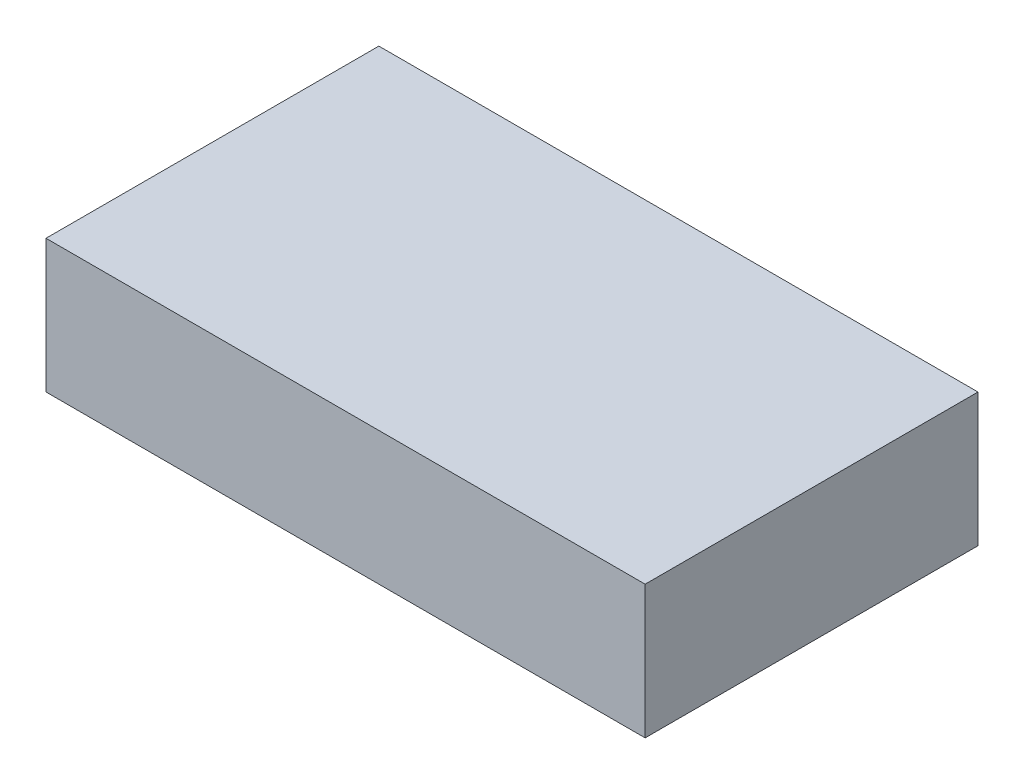
ISO-10303-21;
HEADER;
FILE_DESCRIPTION(('STEP AP214'),'2;1');
FILE_NAME('part.step','',(''),(''),'','','');
FILE_SCHEMA(('AUTOMOTIVE_DESIGN { 1 0 10303 214 1 1 1 1 }'));
ENDSEC;
DATA;
#1=APPLICATION_CONTEXT('core data for automotive mechanical design processes');
#2=APPLICATION_PROTOCOL_DEFINITION('international standard','automotive_design',2000,#1);
#3=PRODUCT_CONTEXT('',#1,'mechanical');
#4=PRODUCT('Part','Part','',(#3));
#5=PRODUCT_RELATED_PRODUCT_CATEGORY('part','',(#4));
#6=PRODUCT_DEFINITION_FORMATION('','',#4);
#7=PRODUCT_DEFINITION_CONTEXT('part definition',#1,'design');
#8=PRODUCT_DEFINITION('design','',#6,#7);
#9=PRODUCT_DEFINITION_SHAPE('','',#8);
#10=(LENGTH_UNIT() NAMED_UNIT(*) SI_UNIT(.MILLI.,.METRE.));
#11=(NAMED_UNIT(*) PLANE_ANGLE_UNIT() SI_UNIT($,.RADIAN.));
#12=(NAMED_UNIT(*) SI_UNIT($,.STERADIAN.) SOLID_ANGLE_UNIT());
#13=UNCERTAINTY_MEASURE_WITH_UNIT(LENGTH_MEASURE(1.E-05),#10,'distance_accuracy_value','');
#14=(GEOMETRIC_REPRESENTATION_CONTEXT(3) GLOBAL_UNCERTAINTY_ASSIGNED_CONTEXT((#13)) GLOBAL_UNIT_ASSIGNED_CONTEXT((#10,
#11,#12)) REPRESENTATION_CONTEXT('',''));
#15=CARTESIAN_POINT('',(0.,0.,0.));
#16=DIRECTION('',(0.,0.,1.));
#17=DIRECTION('',(1.,0.,0.));
#18=AXIS2_PLACEMENT_3D('',#15,#16,#17);
#19=CARTESIAN_POINT('',(13.5,6.,-7.5));
#20=DIRECTION('',(-1.,0.,0.));
#21=DIRECTION('',(0.,0.,1.));
#22=AXIS2_PLACEMENT_3D('',#19,#20,#21);
#23=PLANE('',#22);
#24=DIRECTION('',(0.,0.,-1.));
#25=VECTOR('',#24,1.);
#26=CARTESIAN_POINT('',(13.5,0.,-7.5));
#27=LINE('',#26,#25);
#28=CARTESIAN_POINT('',(13.5,0.,7.5));
#29=VERTEX_POINT('',#28);
#30=CARTESIAN_POINT('',(13.5,0.,-7.5));
#31=VERTEX_POINT('',#30);
#32=EDGE_CURVE('E96',#29,#31,#27,.T.);
#33=ORIENTED_EDGE('',*,*,#32,.T.);
#34=DIRECTION('',(0.,-1.,0.));
#35=VECTOR('',#34,1.);
#36=CARTESIAN_POINT('',(13.5,6.,-7.5));
#37=LINE('',#36,#35);
#38=CARTESIAN_POINT('',(13.5,6.,-7.5));
#39=VERTEX_POINT('',#38);
#40=EDGE_CURVE('E11',#39,#31,#37,.T.);
#41=ORIENTED_EDGE('',*,*,#40,.F.);
#42=DIRECTION('',(0.,0.,-1.));
#43=VECTOR('',#42,1.);
#44=CARTESIAN_POINT('',(13.5,6.,-7.5));
#45=LINE('',#44,#43);
#46=CARTESIAN_POINT('',(13.5,6.,7.5));
#47=VERTEX_POINT('',#46);
#48=EDGE_CURVE('E84',#47,#39,#45,.T.);
#49=ORIENTED_EDGE('',*,*,#48,.F.);
#50=DIRECTION('',(0.,-1.,0.));
#51=VECTOR('',#50,1.);
#52=CARTESIAN_POINT('',(13.5,6.,7.5));
#53=LINE('',#52,#51);
#54=EDGE_CURVE('E92',#47,#29,#53,.T.);
#55=ORIENTED_EDGE('',*,*,#54,.T.);
#56=EDGE_LOOP('',(#33,#41,#49,#55));
#57=FACE_BOUND('',#56,.T.);
#58=ADVANCED_FACE('F33',(#57),#23,.F.);
#59=CARTESIAN_POINT('',(-13.5,6.,-7.5));
#60=DIRECTION('',(0.,0.,1.));
#61=DIRECTION('',(1.,0.,0.));
#62=AXIS2_PLACEMENT_3D('',#59,#60,#61);
#63=PLANE('',#62);
#64=DIRECTION('',(-1.,0.,0.));
#65=VECTOR('',#64,1.);
#66=CARTESIAN_POINT('',(-13.5,0.,-7.5));
#67=LINE('',#66,#65);
#68=CARTESIAN_POINT('',(-13.5,0.,-7.5));
#69=VERTEX_POINT('',#68);
#70=EDGE_CURVE('E88',#31,#69,#67,.T.);
#71=ORIENTED_EDGE('',*,*,#70,.T.);
#72=DIRECTION('',(0.,-1.,0.));
#73=VECTOR('',#72,1.);
#74=CARTESIAN_POINT('',(-13.5,6.,-7.5));
#75=LINE('',#74,#73);
#76=CARTESIAN_POINT('',(-13.5,6.,-7.5));
#77=VERTEX_POINT('',#76);
#78=EDGE_CURVE('E41',#77,#69,#75,.T.);
#79=ORIENTED_EDGE('',*,*,#78,.F.);
#80=DIRECTION('',(-1.,0.,0.));
#81=VECTOR('',#80,1.);
#82=CARTESIAN_POINT('',(-13.5,6.,-7.5));
#83=LINE('',#82,#81);
#84=EDGE_CURVE('E79',#39,#77,#83,.T.);
#85=ORIENTED_EDGE('',*,*,#84,.F.);
#86=ORIENTED_EDGE('',*,*,#40,.T.);
#87=EDGE_LOOP('',(#71,#79,#85,#86));
#88=FACE_BOUND('',#87,.T.);
#89=ADVANCED_FACE('F87',(#88),#63,.F.);
#90=CARTESIAN_POINT('',(-13.5,6.,-7.5));
#91=DIRECTION('',(1.,0.,0.));
#92=DIRECTION('',(0.,0.,-1.));
#93=AXIS2_PLACEMENT_3D('',#90,#91,#92);
#94=PLANE('',#93);
#95=DIRECTION('',(0.,0.,1.));
#96=VECTOR('',#95,1.);
#97=CARTESIAN_POINT('',(-13.5,0.,-7.5));
#98=LINE('',#97,#96);
#99=CARTESIAN_POINT('',(-13.5,0.,7.5));
#100=VERTEX_POINT('',#99);
#101=EDGE_CURVE('E66',#69,#100,#98,.T.);
#102=ORIENTED_EDGE('',*,*,#101,.T.);
#103=DIRECTION('',(0.,-1.,0.));
#104=VECTOR('',#103,1.);
#105=CARTESIAN_POINT('',(-13.5,6.,7.5));
#106=LINE('',#105,#104);
#107=CARTESIAN_POINT('',(-13.5,6.,7.5));
#108=VERTEX_POINT('',#107);
#109=EDGE_CURVE('E89',#108,#100,#106,.T.);
#110=ORIENTED_EDGE('',*,*,#109,.F.);
#111=DIRECTION('',(0.,0.,1.));
#112=VECTOR('',#111,1.);
#113=CARTESIAN_POINT('',(-13.5,6.,-7.5));
#114=LINE('',#113,#112);
#115=EDGE_CURVE('E82',#77,#108,#114,.T.);
#116=ORIENTED_EDGE('',*,*,#115,.F.);
#117=ORIENTED_EDGE('',*,*,#78,.T.);
#118=EDGE_LOOP('',(#102,#110,#116,#117));
#119=FACE_BOUND('',#118,.T.);
#120=ADVANCED_FACE('F90',(#119),#94,.F.);
#121=CARTESIAN_POINT('',(-13.5,6.,7.5));
#122=DIRECTION('',(0.,0.,-1.));
#123=DIRECTION('',(-1.,0.,0.));
#124=AXIS2_PLACEMENT_3D('',#121,#122,#123);
#125=PLANE('',#124);
#126=DIRECTION('',(1.,0.,0.));
#127=VECTOR('',#126,1.);
#128=CARTESIAN_POINT('',(-13.5,0.,7.5));
#129=LINE('',#128,#127);
#130=EDGE_CURVE('E72',#100,#29,#129,.T.);
#131=ORIENTED_EDGE('',*,*,#130,.T.);
#132=ORIENTED_EDGE('',*,*,#54,.F.);
#133=DIRECTION('',(1.,0.,0.));
#134=VECTOR('',#133,1.);
#135=CARTESIAN_POINT('',(-13.5,6.,7.5));
#136=LINE('',#135,#134);
#137=EDGE_CURVE('E49',#108,#47,#136,.T.);
#138=ORIENTED_EDGE('',*,*,#137,.F.);
#139=ORIENTED_EDGE('',*,*,#109,.T.);
#140=EDGE_LOOP('',(#131,#132,#138,#139));
#141=FACE_BOUND('',#140,.T.);
#142=ADVANCED_FACE('F103',(#141),#125,.F.);
#143=CARTESIAN_POINT('',(0.,6.,0.));
#144=DIRECTION('',(0.,1.,0.));
#145=DIRECTION('',(0.,0.,1.));
#146=AXIS2_PLACEMENT_3D('',#143,#144,#145);
#147=PLANE('',#146);
#148=ORIENTED_EDGE('',*,*,#48,.T.);
#149=ORIENTED_EDGE('',*,*,#84,.T.);
#150=ORIENTED_EDGE('',*,*,#115,.T.);
#151=ORIENTED_EDGE('',*,*,#137,.T.);
#152=EDGE_LOOP('',(#148,#149,#150,#151));
#153=FACE_BOUND('',#152,.T.);
#154=ADVANCED_FACE('F80',(#153),#147,.T.);
#155=CARTESIAN_POINT('',(0.,0.,0.));
#156=DIRECTION('',(0.,1.,0.));
#157=DIRECTION('',(0.,0.,1.));
#158=AXIS2_PLACEMENT_3D('',#155,#156,#157);
#159=PLANE('',#158);
#160=ORIENTED_EDGE('',*,*,#32,.F.);
#161=ORIENTED_EDGE('',*,*,#130,.F.);
#162=ORIENTED_EDGE('',*,*,#101,.F.);
#163=ORIENTED_EDGE('',*,*,#70,.F.);
#164=EDGE_LOOP('',(#160,#161,#162,#163));
#165=FACE_BOUND('',#164,.T.);
#166=ADVANCED_FACE('F106',(#165),#159,.F.);
#167=CLOSED_SHELL('',(#58,#89,#120,#142,#154,#166));
#168=MANIFOLD_SOLID_BREP('B2',#167);
#169=ADVANCED_BREP_SHAPE_REPRESENTATION('',(#18,#168),#14);
#170=SHAPE_DEFINITION_REPRESENTATION(#9,#169);
ENDSEC;
END-ISO-10303-21;
